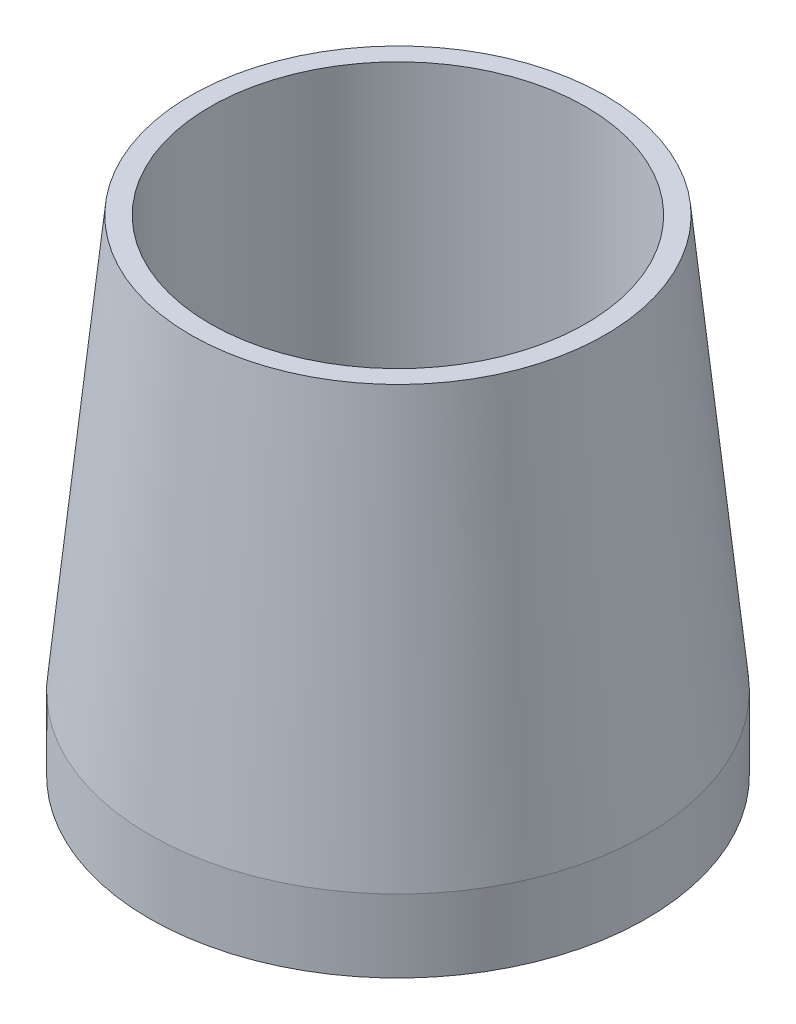
ISO-10303-21;
HEADER;
FILE_DESCRIPTION(('STEP AP214'),'2;1');
FILE_NAME('part.step','',(''),(''),'','','');
FILE_SCHEMA(('AUTOMOTIVE_DESIGN { 1 0 10303 214 1 1 1 1 }'));
ENDSEC;
DATA;
#1=APPLICATION_CONTEXT('core data for automotive mechanical design processes');
#2=APPLICATION_PROTOCOL_DEFINITION('international standard','automotive_design',2000,#1);
#3=PRODUCT_CONTEXT('',#1,'mechanical');
#4=PRODUCT('Part','Part','',(#3));
#5=PRODUCT_RELATED_PRODUCT_CATEGORY('part','',(#4));
#6=PRODUCT_DEFINITION_FORMATION('','',#4);
#7=PRODUCT_DEFINITION_CONTEXT('part definition',#1,'design');
#8=PRODUCT_DEFINITION('design','',#6,#7);
#9=PRODUCT_DEFINITION_SHAPE('','',#8);
#10=(LENGTH_UNIT() NAMED_UNIT(*) SI_UNIT(.MILLI.,.METRE.));
#11=(NAMED_UNIT(*) PLANE_ANGLE_UNIT() SI_UNIT($,.RADIAN.));
#12=(NAMED_UNIT(*) SI_UNIT($,.STERADIAN.) SOLID_ANGLE_UNIT());
#13=UNCERTAINTY_MEASURE_WITH_UNIT(LENGTH_MEASURE(1.E-05),#10,'distance_accuracy_value','');
#14=(GEOMETRIC_REPRESENTATION_CONTEXT(3) GLOBAL_UNCERTAINTY_ASSIGNED_CONTEXT((#13)) GLOBAL_UNIT_ASSIGNED_CONTEXT((#10,
#11,#12)) REPRESENTATION_CONTEXT('',''));
#15=CARTESIAN_POINT('',(0.,0.,0.));
#16=DIRECTION('',(0.,0.,1.));
#17=DIRECTION('',(1.,0.,0.));
#18=AXIS2_PLACEMENT_3D('',#15,#16,#17);
#19=CARTESIAN_POINT('',(0.,0.,0.));
#20=DIRECTION('',(0.,-1.,0.));
#21=DIRECTION('',(0.,0.,-1.));
#22=AXIS2_PLACEMENT_3D('',#19,#20,#21);
#23=PLANE('',#22);
#24=CARTESIAN_POINT('',(0.,0.,0.));
#25=DIRECTION('',(0.,-1.,0.));
#26=DIRECTION('',(0.,0.,-1.));
#27=AXIS2_PLACEMENT_3D('',#24,#25,#26);
#28=CIRCLE('',#27,1.5);
#29=CARTESIAN_POINT('',(0.,0.,-1.5));
#30=VERTEX_POINT('',#29);
#31=EDGE_CURVE('E70',#30,#30,#28,.T.);
#32=ORIENTED_EDGE('',*,*,#31,.F.);
#33=EDGE_LOOP('',(#32));
#34=FACE_BOUND('',#33,.T.);
#35=CARTESIAN_POINT('',(0.,0.,0.));
#36=DIRECTION('',(0.,1.,0.));
#37=DIRECTION('',(0.,0.,1.));
#38=AXIS2_PLACEMENT_3D('',#35,#36,#37);
#39=CIRCLE('',#38,5.125);
#40=CARTESIAN_POINT('',(0.,0.,5.125));
#41=VERTEX_POINT('',#40);
#42=EDGE_CURVE('E10',#41,#41,#39,.T.);
#43=ORIENTED_EDGE('',*,*,#42,.F.);
#44=EDGE_LOOP('',(#43));
#45=FACE_BOUND('',#44,.T.);
#46=ADVANCED_FACE('F43',(#34,#45),#23,.T.);
#47=CARTESIAN_POINT('',(0.,1.5,0.));
#48=DIRECTION('',(0.,1.,0.));
#49=DIRECTION('',(0.,0.,1.));
#50=AXIS2_PLACEMENT_3D('',#47,#48,#49);
#51=CYLINDRICAL_SURFACE('',#50,5.125);
#52=ORIENTED_EDGE('',*,*,#42,.T.);
#53=EDGE_LOOP('',(#52));
#54=FACE_BOUND('',#53,.T.);
#55=CARTESIAN_POINT('',(0.,1.5,0.));
#56=DIRECTION('',(0.,1.,0.));
#57=DIRECTION('',(0.,0.,1.));
#58=AXIS2_PLACEMENT_3D('',#55,#56,#57);
#59=CIRCLE('',#58,5.125);
#60=CARTESIAN_POINT('',(0.,1.5,5.125));
#61=VERTEX_POINT('',#60);
#62=EDGE_CURVE('E51',#61,#61,#59,.T.);
#63=ORIENTED_EDGE('',*,*,#62,.F.);
#64=EDGE_LOOP('',(#63));
#65=FACE_BOUND('',#64,.T.);
#66=ADVANCED_FACE('F98',(#54,#65),#51,.T.);
#67=CARTESIAN_POINT('',(0.,10.,0.));
#68=DIRECTION('',(0.,-1.,0.));
#69=DIRECTION('',(0.,0.,-1.));
#70=AXIS2_PLACEMENT_3D('',#67,#68,#69);
#71=CONICAL_SURFACE('',#70,4.275,0.099668652491162);
#72=ORIENTED_EDGE('',*,*,#62,.T.);
#73=EDGE_LOOP('',(#72));
#74=FACE_BOUND('',#73,.T.);
#75=CARTESIAN_POINT('',(0.,10.,0.));
#76=DIRECTION('',(0.,1.,0.));
#77=DIRECTION('',(0.,0.,1.));
#78=AXIS2_PLACEMENT_3D('',#75,#76,#77);
#79=CIRCLE('',#78,4.275);
#80=CARTESIAN_POINT('',(0.,10.,4.275));
#81=VERTEX_POINT('',#80);
#82=EDGE_CURVE('E57',#81,#81,#79,.T.);
#83=ORIENTED_EDGE('',*,*,#82,.F.);
#84=EDGE_LOOP('',(#83));
#85=FACE_BOUND('',#84,.T.);
#86=ADVANCED_FACE('F94',(#74,#85),#71,.T.);
#87=CARTESIAN_POINT('',(0.,10.,4.275));
#88=DIRECTION('',(0.,1.,0.));
#89=DIRECTION('',(0.,0.,1.));
#90=AXIS2_PLACEMENT_3D('',#87,#88,#89);
#91=PLANE('',#90);
#92=ORIENTED_EDGE('',*,*,#82,.T.);
#93=EDGE_LOOP('',(#92));
#94=FACE_BOUND('',#93,.T.);
#95=CARTESIAN_POINT('',(0.,10.,0.));
#96=DIRECTION('',(0.,1.,0.));
#97=DIRECTION('',(0.,0.,1.));
#98=AXIS2_PLACEMENT_3D('',#95,#96,#97);
#99=CIRCLE('',#98,3.875);
#100=CARTESIAN_POINT('',(0.,10.,3.875));
#101=VERTEX_POINT('',#100);
#102=EDGE_CURVE('E63',#101,#101,#99,.T.);
#103=ORIENTED_EDGE('',*,*,#102,.F.);
#104=EDGE_LOOP('',(#103));
#105=FACE_BOUND('',#104,.T.);
#106=ADVANCED_FACE('F89',(#94,#105),#91,.T.);
#107=CARTESIAN_POINT('',(0.,1.5,0.));
#108=DIRECTION('',(0.,1.,0.));
#109=DIRECTION('',(0.,0.,1.));
#110=AXIS2_PLACEMENT_3D('',#107,#108,#109);
#111=CYLINDRICAL_SURFACE('',#110,3.875);
#112=ORIENTED_EDGE('',*,*,#102,.T.);
#113=EDGE_LOOP('',(#112));
#114=FACE_BOUND('',#113,.T.);
#115=CARTESIAN_POINT('',(0.,1.5,0.));
#116=DIRECTION('',(0.,1.,0.));
#117=DIRECTION('',(0.,0.,1.));
#118=AXIS2_PLACEMENT_3D('',#115,#116,#117);
#119=CIRCLE('',#118,3.875);
#120=CARTESIAN_POINT('',(0.,1.5,3.875));
#121=VERTEX_POINT('',#120);
#122=EDGE_CURVE('E66',#121,#121,#119,.T.);
#123=ORIENTED_EDGE('',*,*,#122,.F.);
#124=EDGE_LOOP('',(#123));
#125=FACE_BOUND('',#124,.T.);
#126=ADVANCED_FACE('F84',(#114,#125),#111,.F.);
#127=CARTESIAN_POINT('',(0.,1.5,3.875));
#128=DIRECTION('',(0.,1.,0.));
#129=DIRECTION('',(0.,0.,1.));
#130=AXIS2_PLACEMENT_3D('',#127,#128,#129);
#131=PLANE('',#130);
#132=CARTESIAN_POINT('',(0.,1.5,0.));
#133=DIRECTION('',(0.,1.,0.));
#134=DIRECTION('',(0.,0.,1.));
#135=AXIS2_PLACEMENT_3D('',#132,#133,#134);
#136=CIRCLE('',#135,1.5);
#137=CARTESIAN_POINT('',(0.,1.5,1.5));
#138=VERTEX_POINT('',#137);
#139=EDGE_CURVE('E46',#138,#138,#136,.T.);
#140=ORIENTED_EDGE('',*,*,#139,.F.);
#141=EDGE_LOOP('',(#140));
#142=FACE_BOUND('',#141,.T.);
#143=ORIENTED_EDGE('',*,*,#122,.T.);
#144=EDGE_LOOP('',(#143));
#145=FACE_BOUND('',#144,.T.);
#146=ADVANCED_FACE('F81',(#142,#145),#131,.T.);
#147=CARTESIAN_POINT('',(0.,10.,0.));
#148=DIRECTION('',(0.,-1.,0.));
#149=DIRECTION('',(0.,0.,-1.));
#150=AXIS2_PLACEMENT_3D('',#147,#148,#149);
#151=CYLINDRICAL_SURFACE('',#150,1.5);
#152=ORIENTED_EDGE('',*,*,#139,.T.);
#153=EDGE_LOOP('',(#152));
#154=FACE_BOUND('',#153,.T.);
#155=ORIENTED_EDGE('',*,*,#31,.T.);
#156=EDGE_LOOP('',(#155));
#157=FACE_BOUND('',#156,.T.);
#158=ADVANCED_FACE('F79',(#154,#157),#151,.F.);
#159=CLOSED_SHELL('',(#46,#66,#86,#106,#126,#146,#158));
#160=MANIFOLD_SOLID_BREP('B2',#159);
#161=ADVANCED_BREP_SHAPE_REPRESENTATION('',(#18,#160),#14);
#162=SHAPE_DEFINITION_REPRESENTATION(#9,#161);
ENDSEC;
END-ISO-10303-21;
